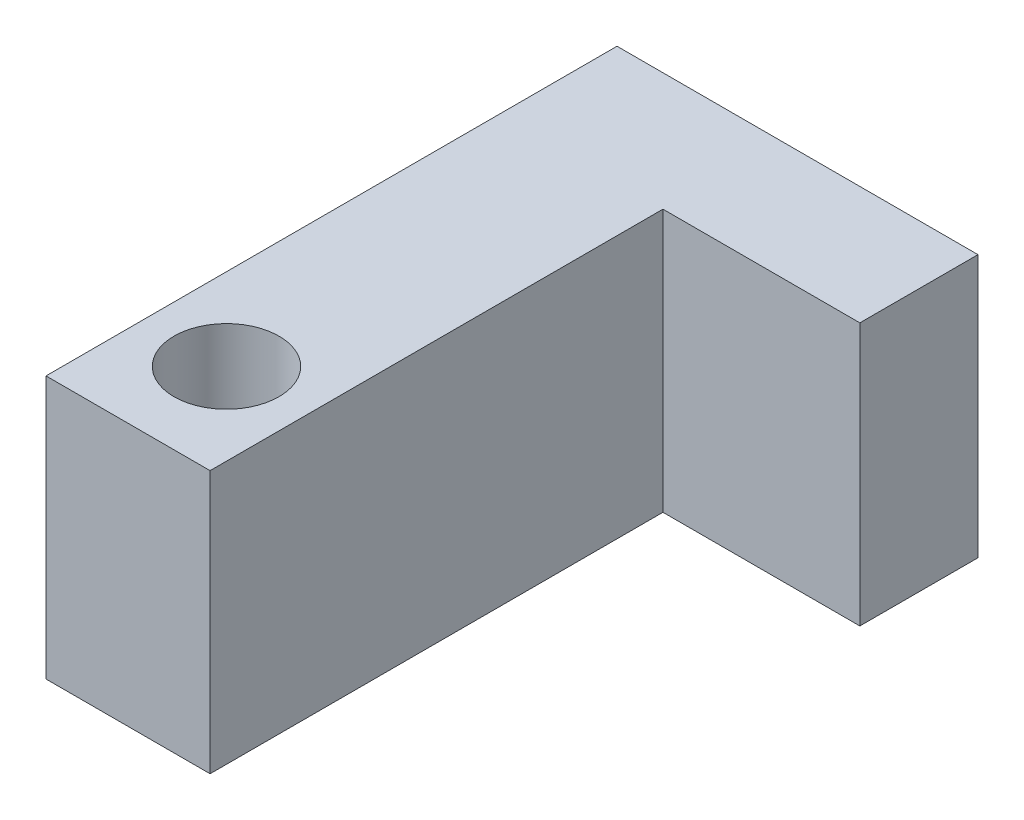
ISO-10303-21;
HEADER;
FILE_DESCRIPTION(('STEP AP214'),'2;1');
FILE_NAME('part.step','',(''),(''),'','','');
FILE_SCHEMA(('AUTOMOTIVE_DESIGN { 1 0 10303 214 1 1 1 1 }'));
ENDSEC;
DATA;
#1=APPLICATION_CONTEXT('core data for automotive mechanical design processes');
#2=APPLICATION_PROTOCOL_DEFINITION('international standard','automotive_design',2000,#1);
#3=PRODUCT_CONTEXT('',#1,'mechanical');
#4=PRODUCT('Part','Part','',(#3));
#5=PRODUCT_RELATED_PRODUCT_CATEGORY('part','',(#4));
#6=PRODUCT_DEFINITION_FORMATION('','',#4);
#7=PRODUCT_DEFINITION_CONTEXT('part definition',#1,'design');
#8=PRODUCT_DEFINITION('design','',#6,#7);
#9=PRODUCT_DEFINITION_SHAPE('','',#8);
#10=(LENGTH_UNIT() NAMED_UNIT(*) SI_UNIT(.MILLI.,.METRE.));
#11=(NAMED_UNIT(*) PLANE_ANGLE_UNIT() SI_UNIT($,.RADIAN.));
#12=(NAMED_UNIT(*) SI_UNIT($,.STERADIAN.) SOLID_ANGLE_UNIT());
#13=UNCERTAINTY_MEASURE_WITH_UNIT(LENGTH_MEASURE(1.E-05),#10,'distance_accuracy_value','');
#14=(GEOMETRIC_REPRESENTATION_CONTEXT(3) GLOBAL_UNCERTAINTY_ASSIGNED_CONTEXT((#13)) GLOBAL_UNIT_ASSIGNED_CONTEXT((#10,
#11,#12)) REPRESENTATION_CONTEXT('',''));
#15=CARTESIAN_POINT('',(0.,0.,0.));
#16=DIRECTION('',(0.,0.,1.));
#17=DIRECTION('',(1.,0.,0.));
#18=AXIS2_PLACEMENT_3D('',#15,#16,#17);
#19=CARTESIAN_POINT('',(-43.1440427462506,2.,0.));
#20=DIRECTION('',(-1.,0.,0.));
#21=DIRECTION('',(0.,0.,1.));
#22=AXIS2_PLACEMENT_3D('',#19,#20,#21);
#23=PLANE('',#22);
#24=DIRECTION('',(0.,0.,-1.));
#25=VECTOR('',#24,1.);
#26=CARTESIAN_POINT('',(-43.1440427462506,0.,0.));
#27=LINE('',#26,#25);
#28=CARTESIAN_POINT('',(-43.1440427462506,0.,-25.259159103622));
#29=VERTEX_POINT('',#28);
#30=CARTESIAN_POINT('',(-43.1440427462506,0.,-29.609159103622));
#31=VERTEX_POINT('',#30);
#32=EDGE_CURVE('E143',#29,#31,#27,.T.);
#33=ORIENTED_EDGE('',*,*,#32,.F.);
#34=DIRECTION('',(0.,-1.,0.));
#35=VECTOR('',#34,1.);
#36=CARTESIAN_POINT('',(-43.1440427462506,2.,-25.259159103622));
#37=LINE('',#36,#35);
#38=CARTESIAN_POINT('',(-43.1440427462506,2.,-25.259159103622));
#39=VERTEX_POINT('',#38);
#40=EDGE_CURVE('E11',#39,#29,#37,.T.);
#41=ORIENTED_EDGE('',*,*,#40,.F.);
#42=DIRECTION('',(0.,0.,-1.));
#43=VECTOR('',#42,1.);
#44=CARTESIAN_POINT('',(-43.1440427462506,2.,0.));
#45=LINE('',#44,#43);
#46=CARTESIAN_POINT('',(-43.1440427462506,2.,-29.609159103622));
#47=VERTEX_POINT('',#46);
#48=EDGE_CURVE('E198',#39,#47,#45,.T.);
#49=ORIENTED_EDGE('',*,*,#48,.T.);
#50=DIRECTION('',(0.,-1.,0.));
#51=VECTOR('',#50,1.);
#52=CARTESIAN_POINT('',(-43.1440427462506,2.,-29.609159103622));
#53=LINE('',#52,#51);
#54=EDGE_CURVE('E59',#47,#31,#53,.T.);
#55=ORIENTED_EDGE('',*,*,#54,.T.);
#56=EDGE_LOOP('',(#33,#41,#49,#55));
#57=FACE_BOUND('',#56,.T.);
#58=ADVANCED_FACE('F41',(#57),#23,.T.);
#59=CARTESIAN_POINT('',(0.,2.,-25.259159103622));
#60=DIRECTION('',(0.,0.,-1.));
#61=DIRECTION('',(-1.,0.,0.));
#62=AXIS2_PLACEMENT_3D('',#59,#60,#61);
#63=PLANE('',#62);
#64=DIRECTION('',(1.,0.,0.));
#65=VECTOR('',#64,1.);
#66=CARTESIAN_POINT('',(0.,0.,-25.259159103622));
#67=LINE('',#66,#65);
#68=CARTESIAN_POINT('',(-41.8940427462506,0.,-25.259159103622));
#69=VERTEX_POINT('',#68);
#70=EDGE_CURVE('E139',#29,#69,#67,.T.);
#71=ORIENTED_EDGE('',*,*,#70,.T.);
#72=DIRECTION('',(0.,-1.,0.));
#73=VECTOR('',#72,1.);
#74=CARTESIAN_POINT('',(-41.8940427462506,2.,-25.259159103622));
#75=LINE('',#74,#73);
#76=CARTESIAN_POINT('',(-41.8940427462506,2.,-25.259159103622));
#77=VERTEX_POINT('',#76);
#78=EDGE_CURVE('E51',#77,#69,#75,.T.);
#79=ORIENTED_EDGE('',*,*,#78,.F.);
#80=DIRECTION('',(1.,0.,0.));
#81=VECTOR('',#80,1.);
#82=CARTESIAN_POINT('',(0.,2.,-25.259159103622));
#83=LINE('',#82,#81);
#84=EDGE_CURVE('E201',#39,#77,#83,.T.);
#85=ORIENTED_EDGE('',*,*,#84,.F.);
#86=ORIENTED_EDGE('',*,*,#40,.T.);
#87=EDGE_LOOP('',(#71,#79,#85,#86));
#88=FACE_BOUND('',#87,.T.);
#89=ADVANCED_FACE('F140',(#88),#63,.F.);
#90=CARTESIAN_POINT('',(-41.8940427462506,2.,0.));
#91=DIRECTION('',(-1.,0.,0.));
#92=DIRECTION('',(0.,0.,1.));
#93=AXIS2_PLACEMENT_3D('',#90,#91,#92);
#94=PLANE('',#93);
#95=DIRECTION('',(0.,0.,-1.));
#96=VECTOR('',#95,1.);
#97=CARTESIAN_POINT('',(-41.8940427462506,0.,0.));
#98=LINE('',#97,#96);
#99=CARTESIAN_POINT('',(-41.8940427462506,0.,-28.709159103622));
#100=VERTEX_POINT('',#99);
#101=EDGE_CURVE('E136',#69,#100,#98,.T.);
#102=ORIENTED_EDGE('',*,*,#101,.T.);
#103=DIRECTION('',(0.,-1.,0.));
#104=VECTOR('',#103,1.);
#105=CARTESIAN_POINT('',(-41.8940427462506,2.,-28.709159103622));
#106=LINE('',#105,#104);
#107=CARTESIAN_POINT('',(-41.8940427462506,2.,-28.709159103622));
#108=VERTEX_POINT('',#107);
#109=EDGE_CURVE('E122',#108,#100,#106,.T.);
#110=ORIENTED_EDGE('',*,*,#109,.F.);
#111=DIRECTION('',(0.,0.,-1.));
#112=VECTOR('',#111,1.);
#113=CARTESIAN_POINT('',(-41.8940427462506,2.,0.));
#114=LINE('',#113,#112);
#115=EDGE_CURVE('E113',#77,#108,#114,.T.);
#116=ORIENTED_EDGE('',*,*,#115,.F.);
#117=ORIENTED_EDGE('',*,*,#78,.T.);
#118=EDGE_LOOP('',(#102,#110,#116,#117));
#119=FACE_BOUND('',#118,.T.);
#120=ADVANCED_FACE('F135',(#119),#94,.F.);
#121=CARTESIAN_POINT('',(0.,2.,-28.709159103622));
#122=DIRECTION('',(0.,0.,-1.));
#123=DIRECTION('',(-1.,0.,0.));
#124=AXIS2_PLACEMENT_3D('',#121,#122,#123);
#125=PLANE('',#124);
#126=DIRECTION('',(1.,0.,0.));
#127=VECTOR('',#126,1.);
#128=CARTESIAN_POINT('',(0.,0.,-28.709159103622));
#129=LINE('',#128,#127);
#130=CARTESIAN_POINT('',(-40.3940427462506,0.,-28.709159103622));
#131=VERTEX_POINT('',#130);
#132=EDGE_CURVE('E120',#100,#131,#129,.T.);
#133=ORIENTED_EDGE('',*,*,#132,.T.);
#134=DIRECTION('',(0.,-1.,0.));
#135=VECTOR('',#134,1.);
#136=CARTESIAN_POINT('',(-40.3940427462506,2.,-28.709159103622));
#137=LINE('',#136,#135);
#138=CARTESIAN_POINT('',(-40.3940427462506,2.,-28.709159103622));
#139=VERTEX_POINT('',#138);
#140=EDGE_CURVE('E101',#139,#131,#137,.T.);
#141=ORIENTED_EDGE('',*,*,#140,.F.);
#142=DIRECTION('',(1.,0.,0.));
#143=VECTOR('',#142,1.);
#144=CARTESIAN_POINT('',(0.,2.,-28.709159103622));
#145=LINE('',#144,#143);
#146=EDGE_CURVE('E107',#108,#139,#145,.T.);
#147=ORIENTED_EDGE('',*,*,#146,.F.);
#148=ORIENTED_EDGE('',*,*,#109,.T.);
#149=EDGE_LOOP('',(#133,#141,#147,#148));
#150=FACE_BOUND('',#149,.T.);
#151=ADVANCED_FACE('F119',(#150),#125,.F.);
#152=CARTESIAN_POINT('',(-40.3940427462506,2.,0.));
#153=DIRECTION('',(-1.,0.,0.));
#154=DIRECTION('',(0.,0.,1.));
#155=AXIS2_PLACEMENT_3D('',#152,#153,#154);
#156=PLANE('',#155);
#157=DIRECTION('',(0.,0.,-1.));
#158=VECTOR('',#157,1.);
#159=CARTESIAN_POINT('',(-40.3940427462506,0.,0.));
#160=LINE('',#159,#158);
#161=CARTESIAN_POINT('',(-40.3940427462506,0.,-29.609159103622));
#162=VERTEX_POINT('',#161);
#163=EDGE_CURVE('E154',#131,#162,#160,.T.);
#164=ORIENTED_EDGE('',*,*,#163,.T.);
#165=DIRECTION('',(0.,-1.,0.));
#166=VECTOR('',#165,1.);
#167=CARTESIAN_POINT('',(-40.3940427462506,2.,-29.609159103622));
#168=LINE('',#167,#166);
#169=CARTESIAN_POINT('',(-40.3940427462506,2.,-29.609159103622));
#170=VERTEX_POINT('',#169);
#171=EDGE_CURVE('E79',#170,#162,#168,.T.);
#172=ORIENTED_EDGE('',*,*,#171,.F.);
#173=DIRECTION('',(0.,0.,-1.));
#174=VECTOR('',#173,1.);
#175=CARTESIAN_POINT('',(-40.3940427462506,2.,0.));
#176=LINE('',#175,#174);
#177=EDGE_CURVE('E97',#139,#170,#176,.T.);
#178=ORIENTED_EDGE('',*,*,#177,.F.);
#179=ORIENTED_EDGE('',*,*,#140,.T.);
#180=EDGE_LOOP('',(#164,#172,#178,#179));
#181=FACE_BOUND('',#180,.T.);
#182=ADVANCED_FACE('F99',(#181),#156,.F.);
#183=CARTESIAN_POINT('',(-42.5190427462506,2.,-26.009159103622));
#184=DIRECTION('',(0.,-1.,0.));
#185=DIRECTION('',(0.,0.,-1.));
#186=AXIS2_PLACEMENT_3D('',#183,#184,#185);
#187=CYLINDRICAL_SURFACE('',#186,0.399999999999998);
#188=CARTESIAN_POINT('',(-42.5190427462506,2.,-26.009159103622));
#189=DIRECTION('',(0.,1.,0.));
#190=DIRECTION('',(0.,0.,1.));
#191=AXIS2_PLACEMENT_3D('',#188,#189,#190);
#192=CIRCLE('',#191,0.399999999999998);
#193=CARTESIAN_POINT('',(-42.5190427462506,2.,-25.609159103622));
#194=VERTEX_POINT('',#193);
#195=EDGE_CURVE('E160',#194,#194,#192,.T.);
#196=ORIENTED_EDGE('',*,*,#195,.T.);
#197=EDGE_LOOP('',(#196));
#198=FACE_BOUND('',#197,.T.);
#199=CARTESIAN_POINT('',(-42.5190427462506,0.,-26.009159103622));
#200=DIRECTION('',(0.,1.,0.));
#201=DIRECTION('',(0.,0.,1.));
#202=AXIS2_PLACEMENT_3D('',#199,#200,#201);
#203=CIRCLE('',#202,0.399999999999998);
#204=CARTESIAN_POINT('',(-42.5190427462506,0.,-25.609159103622));
#205=VERTEX_POINT('',#204);
#206=EDGE_CURVE('E148',#205,#205,#203,.T.);
#207=ORIENTED_EDGE('',*,*,#206,.F.);
#208=EDGE_LOOP('',(#207));
#209=FACE_BOUND('',#208,.T.);
#210=ADVANCED_FACE('F43',(#198,#209),#187,.F.);
#211=CARTESIAN_POINT('',(0.,2.,-29.609159103622));
#212=DIRECTION('',(0.,0.,-1.));
#213=DIRECTION('',(-1.,0.,0.));
#214=AXIS2_PLACEMENT_3D('',#211,#212,#213);
#215=PLANE('',#214);
#216=DIRECTION('',(1.,0.,0.));
#217=VECTOR('',#216,1.);
#218=CARTESIAN_POINT('',(0.,0.,-29.609159103622));
#219=LINE('',#218,#217);
#220=EDGE_CURVE('E157',#31,#162,#219,.T.);
#221=ORIENTED_EDGE('',*,*,#220,.F.);
#222=ORIENTED_EDGE('',*,*,#54,.F.);
#223=DIRECTION('',(1.,0.,0.));
#224=VECTOR('',#223,1.);
#225=CARTESIAN_POINT('',(0.,2.,-29.609159103622));
#226=LINE('',#225,#224);
#227=EDGE_CURVE('E106',#47,#170,#226,.T.);
#228=ORIENTED_EDGE('',*,*,#227,.T.);
#229=ORIENTED_EDGE('',*,*,#171,.T.);
#230=EDGE_LOOP('',(#221,#222,#228,#229));
#231=FACE_BOUND('',#230,.T.);
#232=ADVANCED_FACE('F171',(#231),#215,.T.);
#233=CARTESIAN_POINT('',(0.,2.,0.));
#234=DIRECTION('',(0.,1.,0.));
#235=DIRECTION('',(0.,0.,1.));
#236=AXIS2_PLACEMENT_3D('',#233,#234,#235);
#237=PLANE('',#236);
#238=ORIENTED_EDGE('',*,*,#195,.F.);
#239=EDGE_LOOP('',(#238));
#240=FACE_BOUND('',#239,.T.);
#241=ORIENTED_EDGE('',*,*,#48,.F.);
#242=ORIENTED_EDGE('',*,*,#84,.T.);
#243=ORIENTED_EDGE('',*,*,#115,.T.);
#244=ORIENTED_EDGE('',*,*,#146,.T.);
#245=ORIENTED_EDGE('',*,*,#177,.T.);
#246=ORIENTED_EDGE('',*,*,#227,.F.);
#247=EDGE_LOOP('',(#241,#242,#243,#244,#245,#246));
#248=FACE_BOUND('',#247,.T.);
#249=ADVANCED_FACE('F111',(#240,#248),#237,.T.);
#250=CARTESIAN_POINT('',(0.,0.,0.));
#251=DIRECTION('',(0.,1.,0.));
#252=DIRECTION('',(0.,0.,1.));
#253=AXIS2_PLACEMENT_3D('',#250,#251,#252);
#254=PLANE('',#253);
#255=ORIENTED_EDGE('',*,*,#206,.T.);
#256=EDGE_LOOP('',(#255));
#257=FACE_BOUND('',#256,.T.);
#258=ORIENTED_EDGE('',*,*,#32,.T.);
#259=ORIENTED_EDGE('',*,*,#220,.T.);
#260=ORIENTED_EDGE('',*,*,#163,.F.);
#261=ORIENTED_EDGE('',*,*,#132,.F.);
#262=ORIENTED_EDGE('',*,*,#101,.F.);
#263=ORIENTED_EDGE('',*,*,#70,.F.);
#264=EDGE_LOOP('',(#258,#259,#260,#261,#262,#263));
#265=FACE_BOUND('',#264,.T.);
#266=ADVANCED_FACE('F168',(#257,#265),#254,.F.);
#267=CLOSED_SHELL('',(#58,#89,#120,#151,#182,#210,#232,#249,#266));
#268=MANIFOLD_SOLID_BREP('B2',#267);
#269=ADVANCED_BREP_SHAPE_REPRESENTATION('',(#18,#268),#14);
#270=SHAPE_DEFINITION_REPRESENTATION(#9,#269);
ENDSEC;
END-ISO-10303-21;
